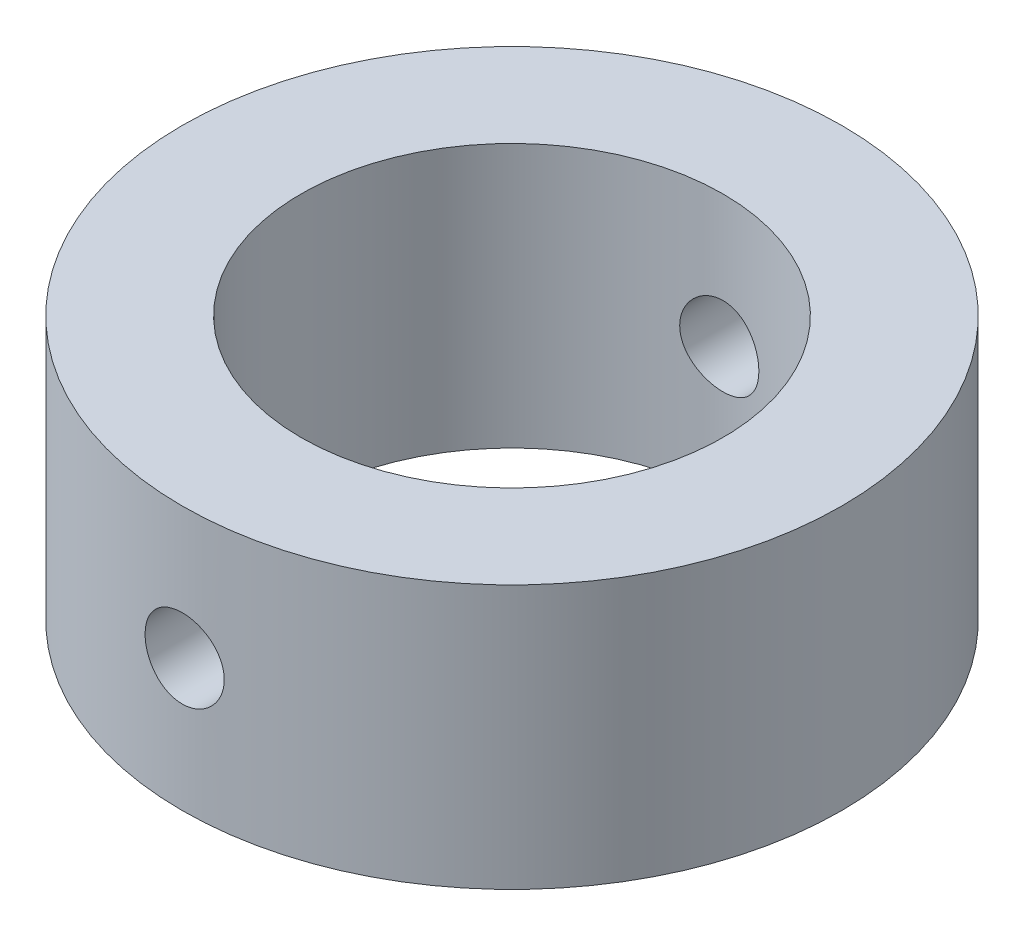
ISO-10303-21;
HEADER;
FILE_DESCRIPTION(('STEP AP214'),'2;1');
FILE_NAME('part.step','',(''),(''),'','','');
FILE_SCHEMA(('AUTOMOTIVE_DESIGN { 1 0 10303 214 1 1 1 1 }'));
ENDSEC;
DATA;
#1=APPLICATION_CONTEXT('core data for automotive mechanical design processes');
#2=APPLICATION_PROTOCOL_DEFINITION('international standard','automotive_design',2000,#1);
#3=PRODUCT_CONTEXT('',#1,'mechanical');
#4=PRODUCT('Part','Part','',(#3));
#5=PRODUCT_RELATED_PRODUCT_CATEGORY('part','',(#4));
#6=PRODUCT_DEFINITION_FORMATION('','',#4);
#7=PRODUCT_DEFINITION_CONTEXT('part definition',#1,'design');
#8=PRODUCT_DEFINITION('design','',#6,#7);
#9=PRODUCT_DEFINITION_SHAPE('','',#8);
#10=(LENGTH_UNIT() NAMED_UNIT(*) SI_UNIT(.MILLI.,.METRE.));
#11=(NAMED_UNIT(*) PLANE_ANGLE_UNIT() SI_UNIT($,.RADIAN.));
#12=(NAMED_UNIT(*) SI_UNIT($,.STERADIAN.) SOLID_ANGLE_UNIT());
#13=UNCERTAINTY_MEASURE_WITH_UNIT(LENGTH_MEASURE(1.E-05),#10,'distance_accuracy_value','');
#14=(GEOMETRIC_REPRESENTATION_CONTEXT(3) GLOBAL_UNCERTAINTY_ASSIGNED_CONTEXT((#13)) GLOBAL_UNIT_ASSIGNED_CONTEXT((#10,
#11,#12)) REPRESENTATION_CONTEXT('',''));
#15=CARTESIAN_POINT('',(0.,0.,0.));
#16=DIRECTION('',(0.,0.,1.));
#17=DIRECTION('',(1.,0.,0.));
#18=AXIS2_PLACEMENT_3D('',#15,#16,#17);
#19=CARTESIAN_POINT('',(0.,10.,0.));
#20=DIRECTION('',(0.,1.,0.));
#21=DIRECTION('',(0.,0.,1.));
#22=AXIS2_PLACEMENT_3D('',#19,#20,#21);
#23=PLANE('',#22);
#24=CARTESIAN_POINT('',(0.,10.,0.));
#25=DIRECTION('',(0.,1.,0.));
#26=DIRECTION('',(0.,0.,1.));
#27=AXIS2_PLACEMENT_3D('',#24,#25,#26);
#28=CIRCLE('',#27,12.5);
#29=CARTESIAN_POINT('',(0.,10.,12.5));
#30=VERTEX_POINT('',#29);
#31=EDGE_CURVE('E10',#30,#30,#28,.T.);
#32=ORIENTED_EDGE('',*,*,#31,.T.);
#33=EDGE_LOOP('',(#32));
#34=FACE_BOUND('',#33,.T.);
#35=CARTESIAN_POINT('',(0.,10.,0.));
#36=DIRECTION('',(0.,1.,0.));
#37=DIRECTION('',(0.,0.,1.));
#38=AXIS2_PLACEMENT_3D('',#35,#36,#37);
#39=CIRCLE('',#38,8.);
#40=CARTESIAN_POINT('',(0.,10.,8.));
#41=VERTEX_POINT('',#40);
#42=EDGE_CURVE('E54',#41,#41,#39,.T.);
#43=ORIENTED_EDGE('',*,*,#42,.F.);
#44=EDGE_LOOP('',(#43));
#45=FACE_BOUND('',#44,.T.);
#46=ADVANCED_FACE('F35',(#34,#45),#23,.T.);
#47=CARTESIAN_POINT('',(0.,0.,0.));
#48=DIRECTION('',(0.,1.,0.));
#49=DIRECTION('',(0.,0.,1.));
#50=AXIS2_PLACEMENT_3D('',#47,#48,#49);
#51=PLANE('',#50);
#52=CARTESIAN_POINT('',(0.,0.,0.));
#53=DIRECTION('',(0.,1.,0.));
#54=DIRECTION('',(0.,0.,1.));
#55=AXIS2_PLACEMENT_3D('',#52,#53,#54);
#56=CIRCLE('',#55,12.5);
#57=CARTESIAN_POINT('',(0.,0.,12.5));
#58=VERTEX_POINT('',#57);
#59=EDGE_CURVE('E49',#58,#58,#56,.T.);
#60=ORIENTED_EDGE('',*,*,#59,.F.);
#61=EDGE_LOOP('',(#60));
#62=FACE_BOUND('',#61,.T.);
#63=CARTESIAN_POINT('',(0.,0.,0.));
#64=DIRECTION('',(0.,1.,0.));
#65=DIRECTION('',(0.,0.,1.));
#66=AXIS2_PLACEMENT_3D('',#63,#64,#65);
#67=CIRCLE('',#66,8.);
#68=CARTESIAN_POINT('',(0.,0.,8.));
#69=VERTEX_POINT('',#68);
#70=EDGE_CURVE('E57',#69,#69,#67,.T.);
#71=ORIENTED_EDGE('',*,*,#70,.T.);
#72=EDGE_LOOP('',(#71));
#73=FACE_BOUND('',#72,.T.);
#74=ADVANCED_FACE('F93',(#62,#73),#51,.F.);
#75=CARTESIAN_POINT('',(0.,10.,0.));
#76=DIRECTION('',(0.,-1.,0.));
#77=DIRECTION('',(0.,0.,-1.));
#78=AXIS2_PLACEMENT_3D('',#75,#76,#77);
#79=CYLINDRICAL_SURFACE('',#78,12.5);
#80=CARTESIAN_POINT('',(0.,6.5,-12.5));
#81=CARTESIAN_POINT('',(-0.0839320235538497,6.49999641802928,-12.499998867873));
#82=CARTESIAN_POINT('',(-0.167917158665595,6.49293167065366,-12.4991457100204));
#83=CARTESIAN_POINT('',(-0.333552285654125,6.46485946792231,-12.495824352711));
#84=CARTESIAN_POINT('',(-0.415199714795035,6.44383727937471,-12.4933544466864));
#85=CARTESIAN_POINT('',(-0.573737397670265,6.38847686173699,-12.4870779632713));
#86=CARTESIAN_POINT('',(-0.650630743796124,6.35414739658791,-12.4832722657654));
#87=CARTESIAN_POINT('',(-0.797549578916001,6.27316563245835,-12.4747479632173));
#88=CARTESIAN_POINT('',(-0.867576283567579,6.22651552012334,-12.4700295202071));
#89=CARTESIAN_POINT('',(-0.999145657672256,6.12196256901238,-12.460180052721));
#90=CARTESIAN_POINT('',(-1.0606483456536,6.06400957994404,-12.4550472515452));
#91=CARTESIAN_POINT('',(-1.17307965519171,5.93860351755605,-12.4449619698576));
#92=CARTESIAN_POINT('',(-1.22400774913237,5.87114997049068,-12.4400094983534));
#93=CARTESIAN_POINT('',(-1.31399171436948,5.72839958735081,-12.4308280185202));
#94=CARTESIAN_POINT('',(-1.35301037836285,5.65307913770993,-12.4266012951985));
#95=CARTESIAN_POINT('',(-1.4178302865078,5.49689564894563,-12.4193730672343));
#96=CARTESIAN_POINT('',(-1.44363199348388,5.41603280401535,-12.4163715196899));
#97=CARTESIAN_POINT('',(-1.481164650227,5.25147357034429,-12.4119503036869));
#98=CARTESIAN_POINT('',(-1.49296288993823,5.16779273578616,-12.4105230726271));
#99=CARTESIAN_POINT('',(-1.50236187609835,4.99962753181792,-12.4093888845306));
#100=CARTESIAN_POINT('',(-1.49996315026424,4.91514319239152,-12.4096818635516));
#101=CARTESIAN_POINT('',(-1.48109158039334,4.74823701760783,-12.4119480733153));
#102=CARTESIAN_POINT('',(-1.46469271611151,4.66580668065991,-12.4139124717338));
#103=CARTESIAN_POINT('',(-1.41840173085033,4.50487648608932,-12.4192864043804));
#104=CARTESIAN_POINT('',(-1.38850935612907,4.4263767024105,-12.4226959657844));
#105=CARTESIAN_POINT('',(-1.31599990349931,4.27530526588044,-12.4305861039738));
#106=CARTESIAN_POINT('',(-1.27335053101962,4.20274926082322,-12.4350693931099));
#107=CARTESIAN_POINT('',(-1.17656086584735,4.06579639454212,-12.444599699395));
#108=CARTESIAN_POINT('',(-1.12242008861578,4.00139987754871,-12.4496467403106));
#109=CARTESIAN_POINT('',(-1.0037737778109,3.88216445781781,-12.4597751654319));
#110=CARTESIAN_POINT('',(-0.939204450256079,3.82738901507147,-12.464856563712));
#111=CARTESIAN_POINT('',(-0.80175397946936,3.72944423949985,-12.4744510399275));
#112=CARTESIAN_POINT('',(-0.728872819540023,3.68627492999042,-12.478964116721));
#113=CARTESIAN_POINT('',(-0.576819654131423,3.61276835718017,-12.4869159430851));
#114=CARTESIAN_POINT('',(-0.497645789357796,3.58243490333478,-12.4903543736405));
#115=CARTESIAN_POINT('',(-0.33527801113672,3.53551063107455,-12.4957665326545));
#116=CARTESIAN_POINT('',(-0.252084271220812,3.51891921999776,-12.4977403242792));
#117=CARTESIAN_POINT('',(-0.0845871981871082,3.50003187225115,-12.4999926250152));
#118=CARTESIAN_POINT('',(-0.000293860216025532,3.49764848379965,-12.5002815046876));
#119=CARTESIAN_POINT('',(0.16749103412163,3.50701428893413,-12.4991593911616));
#120=CARTESIAN_POINT('',(0.250982606163664,3.51876320564768,-12.4977484312654));
#121=CARTESIAN_POINT('',(0.414537131964178,3.55598748200155,-12.4933916690343));
#122=CARTESIAN_POINT('',(0.494609673184518,3.58142130652504,-12.4904505118954));
#123=CARTESIAN_POINT('',(0.64935269884323,3.64525035167679,-12.4833627750896));
#124=CARTESIAN_POINT('',(0.724023012961737,3.68364598074504,-12.4792161574379));
#125=CARTESIAN_POINT('',(0.866233588832522,3.77252145795121,-12.4701542579347));
#126=CARTESIAN_POINT('',(0.933738144813755,3.82305806890541,-12.4652354042322));
#127=CARTESIAN_POINT('',(1.05933812576102,3.93470042320408,-12.455190895971));
#128=CARTESIAN_POINT('',(1.11743320736475,3.99580655207398,-12.4500652338742));
#129=CARTESIAN_POINT('',(1.22287397613077,4.12723780771384,-12.4401529742471));
#130=CARTESIAN_POINT('',(1.27016181615969,4.19760950767192,-12.4353682915654));
#131=CARTESIAN_POINT('',(1.35224657214666,4.34534751253778,-12.4267107496692));
#132=CARTESIAN_POINT('',(1.38704372178037,4.42271368655912,-12.4228378733971));
#133=CARTESIAN_POINT('',(1.44306498334079,4.58205530444735,-12.4164552867251));
#134=CARTESIAN_POINT('',(1.46432210079673,4.6640190059297,-12.4139422637816));
#135=CARTESIAN_POINT('',(1.49276636081758,4.83038448474253,-12.4105542637293));
#136=CARTESIAN_POINT('',(1.49995410263041,4.91478615807866,-12.4096792168553));
#137=CARTESIAN_POINT('',(1.50004516908965,5.08305636481859,-12.4096681633035));
#138=CARTESIAN_POINT('',(1.49303936835675,5.16692486288563,-12.4105210931972));
#139=CARTESIAN_POINT('',(1.46513424336044,5.33228339319708,-12.4138461473713));
#140=CARTESIAN_POINT('',(1.44423491411034,5.41377342458779,-12.4163182722328));
#141=CARTESIAN_POINT('',(1.38916369910273,5.57205226944435,-12.4225998262293));
#142=CARTESIAN_POINT('',(1.35499582785269,5.64884249674774,-12.4264088508406));
#143=CARTESIAN_POINT('',(1.27436641314005,5.79561387353505,-12.4349357269569));
#144=CARTESIAN_POINT('',(1.22790476354723,5.86559496422965,-12.4396535863076));
#145=CARTESIAN_POINT('',(1.12366844823603,5.99722647005442,-12.4495027561294));
#146=CARTESIAN_POINT('',(1.06582601965075,6.05882305163314,-12.4546364290673));
#147=CARTESIAN_POINT('',(0.940610466672237,6.171471239783,-12.4647177484085));
#148=CARTESIAN_POINT('',(0.873235091318005,6.2225203488146,-12.4696653505255));
#149=CARTESIAN_POINT('',(0.730596612325684,6.31277528899943,-12.4788360854662));
#150=CARTESIAN_POINT('',(0.655306617312087,6.35193886286114,-12.4830566108105));
#151=CARTESIAN_POINT('',(0.499211375842655,6.41701188222129,-12.4902709259863));
#152=CARTESIAN_POINT('',(0.418412282181072,6.44293584809019,-12.4932660590307));
#153=CARTESIAN_POINT('',(0.280988550618348,6.47453171016906,-12.4969634163));
#154=CARTESIAN_POINT('',(0.225233284876743,6.48406874194319,-12.4980966397165));
#155=CARTESIAN_POINT('',(0.112993367846846,6.49680407174548,-12.4996153102102));
#156=CARTESIAN_POINT('',(0.0565087213768123,6.50000241162523,-12.5000007622246));
#157=CARTESIAN_POINT('',(0.,6.5,-12.5));
#158=B_SPLINE_CURVE_WITH_KNOTS('',3,(#80,#81,#82,#83,#84,#85,#86,#87,#88,#89,#90,#91,#92,#93,
#94,#95,#96,#97,#98,#99,#100,#101,#102,#103,#104,#105,#106,#107,#108,#109,#110,#111,#112,#113,
#114,#115,#116,#117,#118,#119,#120,#121,#122,#123,#124,#125,#126,#127,#128,#129,#130,#131,#132,
#133,#134,#135,#136,#137,#138,#139,#140,#141,#142,#143,#144,#145,#146,#147,#148,#149,#150,#151,
#152,#153,#154,#155,#156,#157),.UNSPECIFIED.,.T.,.F.,(4,2,2,2,2,2,2,2,2,2,2,2,2,2,2,2,2,2,2,2,2,
2,2,2,2,2,2,2,2,2,2,2,2,2,2,2,2,2,4),(0.,0.25158967547808,0.503445347043117,0.755135431877801,
1.00678087720847,1.25956936097939,1.51237045452442,1.76595344748199,2.01952755999557,
2.27187819171639,2.5242194433424,2.77523546456127,3.02625620626698,3.27791786855268,
3.52959014434631,3.78286472320158,4.036139810863,4.28949001347139,4.5428292891131,
4.79460761312113,5.04638100450539,5.29739451278874,5.54841593150834,5.80063460892782,
6.05286248801782,6.30641037908359,6.55995352653149,6.81287624132444,7.06578818330771,
7.31708596596146,7.56838383881169,7.81960573856942,8.07082980715608,8.3235976201016,
8.57642521760045,8.8301414511973,9.08357882396374,9.25296714728134,9.42235435219904),.UNSPECIFIED.);
#159=CARTESIAN_POINT('',(0.,6.5,-12.5));
#160=VERTEX_POINT('',#159);
#161=EDGE_CURVE('E82',#160,#160,#158,.T.);
#162=ORIENTED_EDGE('',*,*,#161,.T.);
#163=EDGE_LOOP('',(#162));
#164=FACE_BOUND('',#163,.T.);
#165=CARTESIAN_POINT('',(1.5,5.,12.4096736459909));
#166=CARTESIAN_POINT('',(1.49999641586388,4.91607042940482,12.4096748089167));
#167=CARTESIAN_POINT('',(1.49293206748169,4.8320877399393,12.4105342894214));
#168=CARTESIAN_POINT('',(1.46486159354819,4.66645769398422,12.4138782255216));
#169=CARTESIAN_POINT('',(1.44384072619508,4.58481290215949,12.4163643992983));
#170=CARTESIAN_POINT('',(1.38848417307918,4.42628079724309,12.4226761552619));
#171=CARTESIAN_POINT('',(1.35415731394874,4.34939036943189,12.426500849368));
#172=CARTESIAN_POINT('',(1.27318168778971,4.20247642894951,12.4350576249844));
#173=CARTESIAN_POINT('',(1.22653510106007,4.13245170421602,12.4397895458966));
#174=CARTESIAN_POINT('',(1.12198571965019,4.00088011419491,12.4496550027324));
#175=CARTESIAN_POINT('',(1.06403198625323,3.9393738528257,12.4547902908254));
#176=CARTESIAN_POINT('',(0.938622932174394,3.82693564091905,12.4648680792729));
#177=CARTESIAN_POINT('',(0.871167147527068,3.7760042070291,12.4698105701984));
#178=CARTESIAN_POINT('',(0.728414784233988,3.68601673353186,12.4789637011531));
#179=CARTESIAN_POINT('',(0.653094976924494,3.64699729213018,12.4831720690333));
#180=CARTESIAN_POINT('',(0.496912883636388,3.58217576980763,12.4903635621621));
#181=CARTESIAN_POINT('',(0.41605078804277,3.55637323512614,12.4933467294733));
#182=CARTESIAN_POINT('',(0.251493928492541,3.51883887194827,12.4977393662263));
#183=CARTESIAN_POINT('',(0.16781473552169,3.50703967327711,12.4991563682204));
#184=CARTESIAN_POINT('',(-0.000347248334282502,3.49763820034474,12.5002827183051));
#185=CARTESIAN_POINT('',(-0.0848300098341697,3.50003540892089,12.4999921286017));
#186=CARTESIAN_POINT('',(-0.251742833758765,3.51890456092568,12.4977421462633));
#187=CARTESIAN_POINT('',(-0.334181218784106,3.5353040524862,12.4957913442169));
#188=CARTESIAN_POINT('',(-0.495127185045588,3.581599075858,12.490449821119));
#189=CARTESIAN_POINT('',(-0.573634696521302,3.61149484709082,12.4870590745233));
#190=CARTESIAN_POINT('',(-0.724715561629688,3.68401136445326,12.4792038952277));
#191=CARTESIAN_POINT('',(-0.797273648637692,3.72666361800321,12.4747368094346));
#192=CARTESIAN_POINT('',(-0.934229460099392,3.82345944947808,12.465229048358));
#193=CARTESIAN_POINT('',(-0.998626839383445,3.8776035132078,12.4601883488298));
#194=CARTESIAN_POINT('',(-1.11785860561525,3.99625217477023,12.4500603372648));
#195=CARTESIAN_POINT('',(-1.17263019439189,4.06081989068675,12.4449729316271));
#196=CARTESIAN_POINT('',(-1.27056795912578,4.19826575683975,12.4353563023037));
#197=CARTESIAN_POINT('',(-1.31373410365263,4.27114392958224,12.4308270801297));
#198=CARTESIAN_POINT('',(-1.38723839179325,4.42319624507369,12.4228396027608));
#199=CARTESIAN_POINT('',(-1.41757175578821,4.50237272062895,12.4193817467283));
#200=CARTESIAN_POINT('',(-1.46449505016189,4.66474617975059,12.4139364153306));
#201=CARTESIAN_POINT('',(-1.48108558929276,4.74794298505965,12.4119488748366));
#202=CARTESIAN_POINT('',(-1.49996964356083,4.91544154818834,12.4096810007818));
#203=CARTESIAN_POINT('',(-1.50235142135386,4.99973321794057,12.4093901280317));
#204=CARTESIAN_POINT('',(-1.49298299027801,5.16751439042147,12.4105206650573));
#205=CARTESIAN_POINT('',(-1.48123305845624,5.25100390884369,12.411942041265));
#206=CARTESIAN_POINT('',(-1.44400895971009,5.41454789179899,12.4163273137489));
#207=CARTESIAN_POINT('',(-1.41857731249469,5.49461217340466,12.4192864301079));
#208=CARTESIAN_POINT('',(-1.35475538396312,5.64933964148798,12.4264098926624));
#209=CARTESIAN_POINT('',(-1.31636468129306,5.72400265225152,12.4305742780457));
#210=CARTESIAN_POINT('',(-1.22749651360805,5.86620814748731,12.4396643656649));
#211=CARTESIAN_POINT('',(-1.17696103570738,5.93371414344065,12.4445936804928));
#212=CARTESIAN_POINT('',(-1.06532008918354,6.0593175565059,12.4546467770184));
#213=CARTESIAN_POINT('',(-1.0042142422181,6.11741463670294,12.4597705656719));
#214=CARTESIAN_POINT('',(-0.872782136333861,6.22285987361746,12.4696675472455));
#215=CARTESIAN_POINT('',(-0.802409249708916,6.27015012325571,12.4744387628015));
#216=CARTESIAN_POINT('',(-0.654668214705289,6.35223910466455,12.483063621558));
#217=CARTESIAN_POINT('',(-0.577300197822208,6.38703807118722,12.4869172820019));
#218=CARTESIAN_POINT('',(-0.417959622359993,6.4430605024379,12.4932640215257));
#219=CARTESIAN_POINT('',(-0.335999085323591,6.46431775994213,12.4957604851314));
#220=CARTESIAN_POINT('',(-0.169640292495739,6.49276337179108,12.4991255682254));
#221=CARTESIAN_POINT('',(-0.0852421377306308,6.49995230834657,12.4999942550783));
#222=CARTESIAN_POINT('',(0.0830300031278295,6.50004692205616,12.5000056524324));
#223=CARTESIAN_POINT('',(0.166903952329436,6.49304201834161,12.4991591682624));
#224=CARTESIAN_POINT('',(0.332273612398117,6.46513677254876,12.4958567701035));
#225=CARTESIAN_POINT('',(0.413769324044744,6.44423643502524,12.4934008566421));
#226=CARTESIAN_POINT('',(0.572059777991808,6.38916099243421,12.4871544009745));
#227=CARTESIAN_POINT('',(0.648855904373999,6.35498981777275,12.4833642539575));
#228=CARTESIAN_POINT('',(0.795637705262655,6.2743519652078,12.474869622158));
#229=CARTESIAN_POINT('',(0.86562332464685,6.22788518779857,12.4701651299761));
#230=CARTESIAN_POINT('',(0.997254742124291,6.12364315899687,12.4603319681132));
#231=CARTESIAN_POINT('',(1.0588476339384,6.06580132233712,12.4552009088046));
#232=CARTESIAN_POINT('',(1.17148865356204,5.94058848142379,12.4451123432295));
#233=CARTESIAN_POINT('',(1.22253427406543,5.87321521774934,12.4401548784622));
#234=CARTESIAN_POINT('',(1.31278537364373,5.73057853191475,12.4309559603764));
#235=CARTESIAN_POINT('',(1.35194799100155,5.65528783586352,12.4267171228205));
#236=CARTESIAN_POINT('',(1.41701902911872,5.49919112312461,12.419466118837));
#237=CARTESIAN_POINT('',(1.44294198213015,5.41839126440112,12.4164526081981));
#238=CARTESIAN_POINT('',(1.4745350503682,5.28097023044731,12.4127313618494));
#239=CARTESIAN_POINT('',(1.48407082470974,5.22521862402006,12.4115903654975));
#240=CARTESIAN_POINT('',(1.49680448454756,5.11298603393288,12.4100611186528));
#241=CARTESIAN_POINT('',(1.50000241299709,5.0565050552187,12.4096728630583));
#242=CARTESIAN_POINT('',(1.5,5.,12.4096736459909));
#243=B_SPLINE_CURVE_WITH_KNOTS('',3,(#165,#166,#167,#168,#169,#170,#171,#172,#173,#174,#175,
#176,#177,#178,#179,#180,#181,#182,#183,#184,#185,#186,#187,#188,#189,#190,#191,#192,#193,#194,
#195,#196,#197,#198,#199,#200,#201,#202,#203,#204,#205,#206,#207,#208,#209,#210,#211,#212,#213,
#214,#215,#216,#217,#218,#219,#220,#221,#222,#223,#224,#225,#226,#227,#228,#229,#230,#231,#232,
#233,#234,#235,#236,#237,#238,#239,#240,#241,#242),.UNSPECIFIED.,.T.,.F.,(4,2,2,2,2,2,2,2,2,2,2,
2,2,2,2,2,2,2,2,2,2,2,2,2,2,2,2,2,2,2,2,2,2,2,2,2,2,2,4),(0.,0.25158230660961,0.503430774819312,
0.755112462522263,1.0067496383611,1.25954776660377,1.51235824273611,1.7659378087677,
2.01950866836447,2.27185458608052,2.52419131111312,2.77523023079344,3.02627360403335,
3.27794222677635,3.52962149067918,3.78288622204422,4.03615163930559,4.28951130338294,
4.54285974404081,4.79463277043148,5.0464008609825,5.29739099483104,5.54838929022027,
5.80061125155309,6.05284224246468,6.30639464647639,6.55994228515919,6.81285470170488,
7.06575665136928,7.31707030939076,7.56838388503438,7.81962308616498,8.07086432058376,
8.32362252061906,8.57644073759112,8.83016031080823,9.08360079205963,9.25297814464872,
9.42235434931908),.UNSPECIFIED.);
#244=CARTESIAN_POINT('',(1.5,5.,12.4096736459909));
#245=VERTEX_POINT('',#244);
#246=EDGE_CURVE('E77',#245,#245,#243,.T.);
#247=ORIENTED_EDGE('',*,*,#246,.T.);
#248=EDGE_LOOP('',(#247));
#249=FACE_BOUND('',#248,.T.);
#250=ORIENTED_EDGE('',*,*,#31,.F.);
#251=EDGE_LOOP('',(#250));
#252=FACE_BOUND('',#251,.T.);
#253=ORIENTED_EDGE('',*,*,#59,.T.);
#254=EDGE_LOOP('',(#253));
#255=FACE_BOUND('',#254,.T.);
#256=ADVANCED_FACE('F37',(#164,#249,#252,#255),#79,.T.);
#257=CARTESIAN_POINT('',(0.,10.,0.));
#258=DIRECTION('',(0.,-1.,0.));
#259=DIRECTION('',(0.,0.,-1.));
#260=AXIS2_PLACEMENT_3D('',#257,#258,#259);
#261=CYLINDRICAL_SURFACE('',#260,8.);
#262=CARTESIAN_POINT('',(0.,6.5,-8.));
#263=CARTESIAN_POINT('',(-0.0834717464654708,6.49999681041172,-7.99999848833852));
#264=CARTESIAN_POINT('',(-0.166984992730098,6.49300892338062,-7.99868009921714));
#265=CARTESIAN_POINT('',(-0.331658129841798,6.46526000488165,-7.9935478589052));
#266=CARTESIAN_POINT('',(-0.412815974152225,6.44448734936027,-7.98973190166897));
#267=CARTESIAN_POINT('',(-0.570372961851801,6.38982729874066,-7.98003138765458));
#268=CARTESIAN_POINT('',(-0.646776330685344,6.35595174754746,-7.97414869946483));
#269=CARTESIAN_POINT('',(-0.792807973094007,6.27608112307718,-7.96095710599783));
#270=CARTESIAN_POINT('',(-0.862436794477323,6.23008703085518,-7.9536483161829));
#271=CARTESIAN_POINT('',(-0.993783715930503,6.12670023199633,-7.93831336430504));
#272=CARTESIAN_POINT('',(-1.05540895503183,6.06919055532986,-7.93028034856351));
#273=CARTESIAN_POINT('',(-1.16819606135369,5.94465669091244,-7.9144531845865));
#274=CARTESIAN_POINT('',(-1.21935717689242,5.87763182023071,-7.90665905354527));
#275=CARTESIAN_POINT('',(-1.31014998665793,5.73531391163603,-7.89212551245005));
#276=CARTESIAN_POINT('',(-1.34968721969605,5.65995962968276,-7.88539493886182));
#277=CARTESIAN_POINT('',(-1.41550524332283,5.50353108482321,-7.87384713211987));
#278=CARTESIAN_POINT('',(-1.44178717713098,5.42245731588878,-7.86902973396962));
#279=CARTESIAN_POINT('',(-1.480050535035,5.25788476908559,-7.8619226957455));
#280=CARTESIAN_POINT('',(-1.49219390192039,5.17442490279654,-7.85960445366405));
#281=CARTESIAN_POINT('',(-1.50233808095346,5.00662261519175,-7.85767197152761));
#282=CARTESIAN_POINT('',(-1.50034016135374,4.9222802736977,-7.8580574889876));
#283=CARTESIAN_POINT('',(-1.48238979602362,4.75628047473395,-7.86146292701753));
#284=CARTESIAN_POINT('',(-1.46662149996045,4.67460228569985,-7.86444808147334));
#285=CARTESIAN_POINT('',(-1.42186799396207,4.51507158021739,-7.87266183284666));
#286=CARTESIAN_POINT('',(-1.39288222239499,4.4372192264907,-7.87789052509516));
#287=CARTESIAN_POINT('',(-1.322336471793,4.28701132099974,-7.89003855292589));
#288=CARTESIAN_POINT('',(-1.28070213532456,4.21469152941919,-7.89696783823366));
#289=CARTESIAN_POINT('',(-1.18609368930416,4.07799527145977,-7.91172971602918));
#290=CARTESIAN_POINT('',(-1.13311842889266,4.0136196122852,-7.91956240015522));
#291=CARTESIAN_POINT('',(-1.01633905685298,3.89357504432754,-7.93540001272164));
#292=CARTESIAN_POINT('',(-0.952377436860682,3.83805934754826,-7.94340571024031));
#293=CARTESIAN_POINT('',(-0.815968037098825,3.73852275932459,-7.95857386108318));
#294=CARTESIAN_POINT('',(-0.743520172255768,3.69450198312958,-7.96573630595245));
#295=CARTESIAN_POINT('',(-0.592034988874667,3.61918224612998,-7.97842539677509));
#296=CARTESIAN_POINT('',(-0.512989564446493,3.5878992208821,-7.98394999136289));
#297=CARTESIAN_POINT('',(-0.350639115398696,3.53909790690784,-7.99272505402719));
#298=CARTESIAN_POINT('',(-0.267334544277787,3.52157815595464,-7.99597576367994));
#299=CARTESIAN_POINT('',(-0.100148652903385,3.50101396898173,-7.99980360641981));
#300=CARTESIAN_POINT('',(-0.0162940126341349,3.49775960847027,-8.00041950912279));
#301=CARTESIAN_POINT('',(0.150761248092184,3.50525547954765,-7.99901543598228));
#302=CARTESIAN_POINT('',(0.233961900480386,3.51600502306526,-7.99699558964431));
#303=CARTESIAN_POINT('',(0.396681573218217,3.55102903518337,-7.99057111500406));
#304=CARTESIAN_POINT('',(0.476224261046064,3.57519728253781,-7.98618522374031));
#305=CARTESIAN_POINT('',(0.630128631824633,3.63625770677879,-7.97551842212498));
#306=CARTESIAN_POINT('',(0.704489962595103,3.67315074756579,-7.96923738311334));
#307=CARTESIAN_POINT('',(0.846816671513214,3.75907812815951,-7.95538030357666));
#308=CARTESIAN_POINT('',(0.914703277015121,3.80824073853684,-7.94779086174563));
#309=CARTESIAN_POINT('',(1.04133832326454,3.91713813736236,-7.93219343489712));
#310=CARTESIAN_POINT('',(1.10008590976087,3.97687391300133,-7.92418541084687));
#311=CARTESIAN_POINT('',(1.20757295872048,4.10617231891143,-7.9085247569745));
#312=CARTESIAN_POINT('',(1.25616916218577,4.17585490812539,-7.90087825860257));
#313=CARTESIAN_POINT('',(1.34096675057787,4.32251762452375,-7.88692985578532));
#314=CARTESIAN_POINT('',(1.37716859613924,4.39949748037047,-7.8806279013735));
#315=CARTESIAN_POINT('',(1.43594673512823,4.55820586724254,-7.87013024209574));
#316=CARTESIAN_POINT('',(1.45858868794786,4.63990937955933,-7.86592440436878));
#317=CARTESIAN_POINT('',(1.48980679326235,4.8060472225214,-7.86007203802415));
#318=CARTESIAN_POINT('',(1.49838453270708,4.8904812439704,-7.8584252206579));
#319=CARTESIAN_POINT('',(1.50117762148355,5.05824833144151,-7.85789199803857));
#320=CARTESIAN_POINT('',(1.49561895003499,5.141577580957,-7.85896215974293));
#321=CARTESIAN_POINT('',(1.47079175378803,5.30609142204529,-7.86364600659998));
#322=CARTESIAN_POINT('',(1.45152331089332,5.38727602642744,-7.86725967655747));
#323=CARTESIAN_POINT('',(1.39991887583263,5.54507448479548,-7.8766050802318));
#324=CARTESIAN_POINT('',(1.36760735397252,5.62169659134577,-7.88233284594965));
#325=CARTESIAN_POINT('',(1.29085868912204,5.76846825424084,-7.8952638755184));
#326=CARTESIAN_POINT('',(1.24642068948186,5.83861735284478,-7.90246724360119));
#327=CARTESIAN_POINT('',(1.14589487339535,5.9715836800423,-7.91767266107745));
#328=CARTESIAN_POINT('',(1.08964259864303,6.0342754125671,-7.92568505353043));
#329=CARTESIAN_POINT('',(0.96742792674229,6.14940516246452,-7.94152833918735));
#330=CARTESIAN_POINT('',(0.901463301891615,6.20184082098014,-7.94935919027328));
#331=CARTESIAN_POINT('',(0.760984945071872,6.29541095262706,-7.96403975968049));
#332=CARTESIAN_POINT('',(0.686399590640516,6.33643942849064,-7.97088000990561));
#333=CARTESIAN_POINT('',(0.531290113653833,6.40531763660514,-7.98271619380687));
#334=CARTESIAN_POINT('',(0.450771651705248,6.43317974704691,-7.98771385879037));
#335=CARTESIAN_POINT('',(0.308347202825154,6.46927731441867,-7.99428290707632));
#336=CARTESIAN_POINT('',(0.247273810251871,6.4807786303128,-7.99641470878206));
#337=CARTESIAN_POINT('',(0.124141247115159,6.49614106211645,-7.9992737995401));
#338=CARTESIAN_POINT('',(0.0620821016527099,6.50000237225591,-8.00000112429805));
#339=CARTESIAN_POINT('',(0.,6.5,-8.));
#340=B_SPLINE_CURVE_WITH_KNOTS('',3,(#262,#263,#264,#265,#266,#267,#268,#269,#270,#271,#272,
#273,#274,#275,#276,#277,#278,#279,#280,#281,#282,#283,#284,#285,#286,#287,#288,#289,#290,#291,
#292,#293,#294,#295,#296,#297,#298,#299,#300,#301,#302,#303,#304,#305,#306,#307,#308,#309,#310,
#311,#312,#313,#314,#315,#316,#317,#318,#319,#320,#321,#322,#323,#324,#325,#326,#327,#328,#329,
#330,#331,#332,#333,#334,#335,#336,#337,#338,#339),.UNSPECIFIED.,.T.,.F.,(4,2,2,2,2,2,2,2,2,2,2,
2,2,2,2,2,2,2,2,2,2,2,2,2,2,2,2,2,2,2,2,2,2,2,2,2,2,2,4),(0.,0.250188200964924,
0.500587642535452,0.750761271230907,1.00091465336891,1.25375118013631,1.50660586283617,
1.76146190504357,2.01629596311948,2.26818151445336,2.52004447587256,2.76859000612766,
3.01714609846787,3.26719262629531,3.5172645404986,3.77127768464077,4.02529337544948,
4.27962588321699,4.53393136673745,4.78448174076097,5.03501980464584,5.28360233907828,
5.53220175338032,5.78351778017708,6.03485728413098,6.28953436987299,6.54420198954945,
6.79762627818559,7.05102196946513,7.30039252231748,7.54976158541507,7.79866496207693,
8.04758592655423,8.3002336996638,8.55293951262256,8.80792048916315,9.06266126931173,
9.24874344524409,9.43482089039541),.UNSPECIFIED.);
#341=CARTESIAN_POINT('',(0.,6.5,-8.));
#342=VERTEX_POINT('',#341);
#343=EDGE_CURVE('E40',#342,#342,#340,.T.);
#344=ORIENTED_EDGE('',*,*,#343,.F.);
#345=EDGE_LOOP('',(#344));
#346=FACE_BOUND('',#345,.T.);
#347=CARTESIAN_POINT('',(1.5,5.,7.85811682275086));
#348=CARTESIAN_POINT('',(1.49999679883246,4.91654279198826,7.85811843793494));
#349=CARTESIAN_POINT('',(1.49301126348936,4.83304405178161,7.85946079760266));
#350=CARTESIAN_POINT('',(1.46527253251805,4.66840103841809,7.86467851014364));
#351=CARTESIAN_POINT('',(1.44450765768477,4.58725882357252,7.86855601173205));
#352=CARTESIAN_POINT('',(1.38987035617788,4.42973492862912,7.87838976464885));
#353=CARTESIAN_POINT('',(1.35601013954374,4.35334889069271,7.88434407905997));
#354=CARTESIAN_POINT('',(1.27617565760366,4.20734644071319,7.89765826320959));
#355=CARTESIAN_POINT('',(1.23020233759193,4.1377295009967,7.90501802325622));
#356=CARTESIAN_POINT('',(1.12683678942622,4.00636980080087,7.92041614838944));
#357=CARTESIAN_POINT('',(1.06932292933092,3.94472351652827,7.92846116625679));
#358=CARTESIAN_POINT('',(0.94477177880355,3.83189561040044,7.94426457664034));
#359=CARTESIAN_POINT('',(0.877733863624943,3.78071467557521,7.95202295031153));
#360=CARTESIAN_POINT('',(0.735403894570162,3.68990062339948,7.96645017828405));
#361=CARTESIAN_POINT('',(0.660052840033865,3.65035846648058,7.97311028052363));
#362=CARTESIAN_POINT('',(0.503631283250762,3.58453045772647,7.98451608632931));
#363=CARTESIAN_POINT('',(0.422561251859505,3.55824351600978,7.98926194728334));
#364=CARTESIAN_POINT('',(0.258002746187415,3.51997045138887,7.99625755123778));
#365=CARTESIAN_POINT('',(0.174553323244857,3.50782169407732,7.99853565976327));
#366=CARTESIAN_POINT('',(0.00677167603538251,3.4976631122996,8.00043684615594));
#367=CARTESIAN_POINT('',(-0.077560472447671,3.49965208386094,8.00006015010697));
#368=CARTESIAN_POINT('',(-0.243598357899397,3.51758777114715,7.99671633763241));
#369=CARTESIAN_POINT('',(-0.32532376045147,3.53335936943001,7.99378172247214));
#370=CARTESIAN_POINT('',(-0.484947165715476,3.57813564939524,7.98568826333561));
#371=CARTESIAN_POINT('',(-0.562845028826541,3.6071408133458,7.98052933829966));
#372=CARTESIAN_POINT('',(-0.713110065751522,3.6777277310583,7.96851260297339));
#373=CARTESIAN_POINT('',(-0.785443571838533,3.7193794879125,7.96164537590825));
#374=CARTESIAN_POINT('',(-0.922159977214638,3.81402566907715,7.9469714754285));
#375=CARTESIAN_POINT('',(-0.986542066910785,3.86702124688758,7.93916470651164));
#376=CARTESIAN_POINT('',(-1.10656561896904,3.98381570298353,7.92333513680567));
#377=CARTESIAN_POINT('',(-1.16205790757041,4.04776778390208,7.91531085901621));
#378=CARTESIAN_POINT('',(-1.26155171851261,4.18414953127863,7.9000650892462));
#379=CARTESIAN_POINT('',(-1.30555307271182,4.25657932176464,7.89284360901351));
#380=CARTESIAN_POINT('',(-1.38085852224478,4.40805827070266,7.88001893307121));
#381=CARTESIAN_POINT('',(-1.41214093645421,4.48711845719065,7.87441850530261));
#382=CARTESIAN_POINT('',(-1.46093656975056,4.6495011841232,7.86551242396689));
#383=CARTESIAN_POINT('',(-1.47845134901108,4.73282324046479,7.8622065103862));
#384=CARTESIAN_POINT('',(-1.49899672649739,4.90001932885588,7.85831520301005));
#385=CARTESIAN_POINT('',(-1.50224164285859,4.98386611556552,7.85768955816136));
#386=CARTESIAN_POINT('',(-1.49472968881724,5.15090345508715,7.8591219142084));
#387=CARTESIAN_POINT('',(-1.48397351086433,5.23409404014808,7.86117978238611));
#388=CARTESIAN_POINT('',(-1.44894868195883,5.39675290305439,7.86770980063205));
#389=CARTESIAN_POINT('',(-1.4247923858399,5.4762462526249,7.87216186690878));
#390=CARTESIAN_POINT('',(-1.3637722437906,5.63005718973016,7.88296134156618));
#391=CARTESIAN_POINT('',(-1.32690746128795,5.70437439531533,7.88930888963281));
#392=CARTESIAN_POINT('',(-1.2410235311966,5.84666761904317,7.90327577863685));
#393=CARTESIAN_POINT('',(-1.19186899639621,5.91456053786607,7.91090895425315));
#394=CARTESIAN_POINT('',(-1.08298344344247,6.04121204021433,7.926548113681));
#395=CARTESIAN_POINT('',(-1.02325147433084,6.09996980155577,7.93455413096494));
#396=CARTESIAN_POINT('',(-0.893949417870385,6.20748376353413,7.95016624005946));
#397=CARTESIAN_POINT('',(-0.824258534095889,6.25609582660597,7.95776555833305));
#398=CARTESIAN_POINT('',(-0.677574523040139,6.34092120617767,7.97159404810351));
#399=CARTESIAN_POINT('',(-0.600581677038527,6.37713500002501,7.97782327234725));
#400=CARTESIAN_POINT('',(-0.441877541578683,6.43592009786408,7.98818057995848));
#401=CARTESIAN_POINT('',(-0.360193213078987,6.45856218756141,7.99231954730142));
#402=CARTESIAN_POINT('',(-0.194096227381569,6.48978704828989,7.99807642083745));
#403=CARTESIAN_POINT('',(-0.10968385821585,6.49837129866271,7.99969459229933));
#404=CARTESIAN_POINT('',(0.0580907602505099,6.50118530151844,8.00022227515441));
#405=CARTESIAN_POINT('',(0.141449307066269,6.49563275312953,7.99917286625032));
#406=CARTESIAN_POINT('',(0.3060233692792,6.47080757223156,7.99456866611703));
#407=CARTESIAN_POINT('',(0.38723890521369,6.45153507125579,7.99101389890671));
#408=CARTESIAN_POINT('',(0.545106475595485,6.39990879261628,7.98179837978045));
#409=CARTESIAN_POINT('',(0.621766319318224,6.36757818711899,7.97614135981576));
#410=CARTESIAN_POINT('',(0.768605631316695,6.29077954634482,7.96333372068771));
#411=CARTESIAN_POINT('',(0.838784665003272,6.24631069789335,7.95618300146483));
#412=CARTESIAN_POINT('',(0.971755027780008,6.14574854555768,7.94104779859941));
#413=CARTESIAN_POINT('',(1.03442623539053,6.08949796613829,7.93305284591272));
#414=CARTESIAN_POINT('',(1.14951536065485,5.96729543750729,7.91719633538833));
#415=CARTESIAN_POINT('',(1.2019308632478,5.90134120962628,7.90933480936765));
#416=CARTESIAN_POINT('',(1.29547633945385,5.76087354529666,7.89455577425926));
#417=CARTESIAN_POINT('',(1.33649740531872,5.68628656033236,7.88764767280729));
#418=CARTESIAN_POINT('',(1.40536132423417,5.53117421002026,7.87567084650033));
#419=CARTESIAN_POINT('',(1.43321661638912,5.45065453341062,7.87060038649116));
#420=CARTESIAN_POINT('',(1.46929726596175,5.30824771193409,7.86393016292125));
#421=CARTESIAN_POINT('',(1.4807910573985,5.24719427623805,7.86176310717932));
#422=CARTESIAN_POINT('',(1.49614351076215,5.12410153157968,7.85885585595504));
#423=CARTESIAN_POINT('',(1.50000238052127,5.06206224949967,7.85811562163282));
#424=CARTESIAN_POINT('',(1.5,5.,7.85811682275086));
#425=B_SPLINE_CURVE_WITH_KNOTS('',3,(#347,#348,#349,#350,#351,#352,#353,#354,#355,#356,#357,
#358,#359,#360,#361,#362,#363,#364,#365,#366,#367,#368,#369,#370,#371,#372,#373,#374,#375,#376,
#377,#378,#379,#380,#381,#382,#383,#384,#385,#386,#387,#388,#389,#390,#391,#392,#393,#394,#395,
#396,#397,#398,#399,#400,#401,#402,#403,#404,#405,#406,#407,#408,#409,#410,#411,#412,#413,#414,
#415,#416,#417,#418,#419,#420,#421,#422,#423,#424),.UNSPECIFIED.,.T.,.F.,(4,2,2,2,2,2,2,2,2,2,2,
2,2,2,2,2,2,2,2,2,2,2,2,2,2,2,2,2,2,2,2,2,2,2,2,2,2,2,4),(0.,0.250144505793186,
0.500501302380393,0.750625227978433,1.00072963993908,1.25362335698691,1.50653367069315,
1.76137104348047,2.0161874593964,2.26804275460261,2.51987660200648,2.76855650598725,
3.01724547328425,3.26733691984219,3.51745380911785,3.77140614764064,4.025362201924,
4.27974936118267,4.53410768866488,4.78463248587075,5.03514489338718,5.28358792315369,
5.53204926624317,5.78337862654144,6.03473059394677,6.28944125495871,6.54414210821705,
6.79750269418683,7.0508366166733,7.30029300570138,7.54974700322167,7.79876026530358,
8.0477902135711,8.30038464008745,8.55303847730765,8.80803001818118,9.06278015749119,
9.24880307527215,9.43482092920425),.UNSPECIFIED.);
#426=CARTESIAN_POINT('',(1.5,5.,7.85811682275086));
#427=VERTEX_POINT('',#426);
#428=EDGE_CURVE('E59',#427,#427,#425,.T.);
#429=ORIENTED_EDGE('',*,*,#428,.F.);
#430=EDGE_LOOP('',(#429));
#431=FACE_BOUND('',#430,.T.);
#432=ORIENTED_EDGE('',*,*,#42,.T.);
#433=EDGE_LOOP('',(#432));
#434=FACE_BOUND('',#433,.T.);
#435=ORIENTED_EDGE('',*,*,#70,.F.);
#436=EDGE_LOOP('',(#435));
#437=FACE_BOUND('',#436,.T.);
#438=ADVANCED_FACE('F64',(#346,#431,#434,#437),#261,.F.);
#439=CARTESIAN_POINT('',(0.,5.,-20.));
#440=DIRECTION('',(0.,0.,1.));
#441=DIRECTION('',(1.,0.,0.));
#442=AXIS2_PLACEMENT_3D('',#439,#440,#441);
#443=CYLINDRICAL_SURFACE('',#442,1.5);
#444=ORIENTED_EDGE('',*,*,#428,.T.);
#445=EDGE_LOOP('',(#444));
#446=FACE_BOUND('',#445,.T.);
#447=ORIENTED_EDGE('',*,*,#246,.F.);
#448=EDGE_LOOP('',(#447));
#449=FACE_BOUND('',#448,.T.);
#450=ADVANCED_FACE('F70',(#446,#449),#443,.F.);
#451=ORIENTED_EDGE('',*,*,#343,.T.);
#452=EDGE_LOOP('',(#451));
#453=FACE_BOUND('',#452,.T.);
#454=ORIENTED_EDGE('',*,*,#161,.F.);
#455=EDGE_LOOP('',(#454));
#456=FACE_BOUND('',#455,.T.);
#457=ADVANCED_FACE('F67',(#453,#456),#443,.F.);
#458=CLOSED_SHELL('',(#46,#74,#256,#438,#450,#457));
#459=MANIFOLD_SOLID_BREP('B2',#458);
#460=ADVANCED_BREP_SHAPE_REPRESENTATION('',(#18,#459),#14);
#461=SHAPE_DEFINITION_REPRESENTATION(#9,#460);
ENDSEC;
END-ISO-10303-21;
